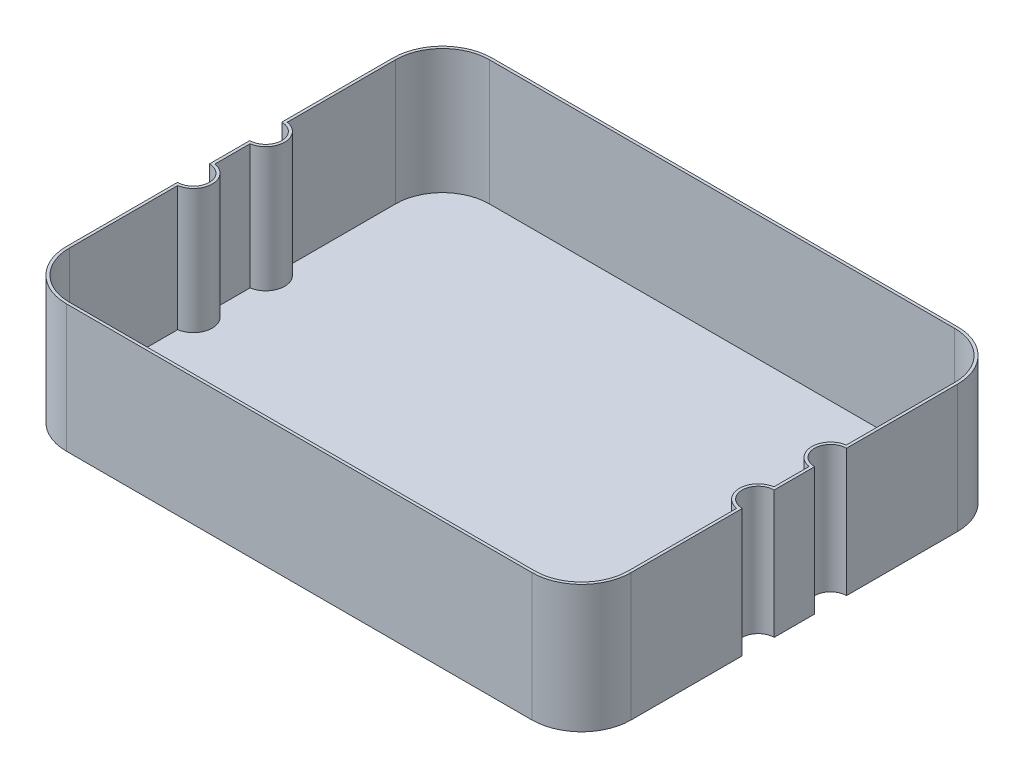
ISO-10303-21;
HEADER;
FILE_DESCRIPTION(('STEP AP214'),'2;1');
FILE_NAME('part.step','',(''),(''),'','','');
FILE_SCHEMA(('AUTOMOTIVE_DESIGN { 1 0 10303 214 1 1 1 1 }'));
ENDSEC;
DATA;
#1=APPLICATION_CONTEXT('core data for automotive mechanical design processes');
#2=APPLICATION_PROTOCOL_DEFINITION('international standard','automotive_design',2000,#1);
#3=PRODUCT_CONTEXT('',#1,'mechanical');
#4=PRODUCT('Part','Part','',(#3));
#5=PRODUCT_RELATED_PRODUCT_CATEGORY('part','',(#4));
#6=PRODUCT_DEFINITION_FORMATION('','',#4);
#7=PRODUCT_DEFINITION_CONTEXT('part definition',#1,'design');
#8=PRODUCT_DEFINITION('design','',#6,#7);
#9=PRODUCT_DEFINITION_SHAPE('','',#8);
#10=(LENGTH_UNIT() NAMED_UNIT(*) SI_UNIT(.MILLI.,.METRE.));
#11=(NAMED_UNIT(*) PLANE_ANGLE_UNIT() SI_UNIT($,.RADIAN.));
#12=(NAMED_UNIT(*) SI_UNIT($,.STERADIAN.) SOLID_ANGLE_UNIT());
#13=UNCERTAINTY_MEASURE_WITH_UNIT(LENGTH_MEASURE(1.E-05),#10,'distance_accuracy_value','');
#14=(GEOMETRIC_REPRESENTATION_CONTEXT(3) GLOBAL_UNCERTAINTY_ASSIGNED_CONTEXT((#13)) GLOBAL_UNIT_ASSIGNED_CONTEXT((#10,
#11,#12)) REPRESENTATION_CONTEXT('',''));
#15=CARTESIAN_POINT('',(0.,0.,0.));
#16=DIRECTION('',(0.,0.,1.));
#17=DIRECTION('',(1.,0.,0.));
#18=AXIS2_PLACEMENT_3D('',#15,#16,#17);
#19=CARTESIAN_POINT('',(199.,90.,150.));
#20=DIRECTION('',(-1.,0.,0.));
#21=DIRECTION('',(0.,0.,1.));
#22=AXIS2_PLACEMENT_3D('',#19,#20,#21);
#23=PLANE('',#22);
#24=DIRECTION('',(0.,0.,-1.));
#25=VECTOR('',#24,1.);
#26=CARTESIAN_POINT('',(199.,0.,150.));
#27=LINE('',#26,#25);
#28=CARTESIAN_POINT('',(199.,0.,14.2499999999999));
#29=VERTEX_POINT('',#28);
#30=CARTESIAN_POINT('',(199.,0.,-14.25));
#31=VERTEX_POINT('',#30);
#32=EDGE_CURVE('E434',#29,#31,#27,.T.);
#33=ORIENTED_EDGE('',*,*,#32,.T.);
#34=DIRECTION('',(0.,1.,0.));
#35=VECTOR('',#34,1.);
#36=CARTESIAN_POINT('',(199.,0.,-14.25));
#37=LINE('',#36,#35);
#38=CARTESIAN_POINT('',(199.,90.,-14.25));
#39=VERTEX_POINT('',#38);
#40=EDGE_CURVE('E58',#31,#39,#37,.T.);
#41=ORIENTED_EDGE('',*,*,#40,.T.);
#42=DIRECTION('',(0.,0.,-1.));
#43=VECTOR('',#42,1.);
#44=CARTESIAN_POINT('',(199.,90.,150.));
#45=LINE('',#44,#43);
#46=CARTESIAN_POINT('',(199.,90.,14.2499999999999));
#47=VERTEX_POINT('',#46);
#48=EDGE_CURVE('E417',#47,#39,#45,.T.);
#49=ORIENTED_EDGE('',*,*,#48,.F.);
#50=DIRECTION('',(0.,1.,0.));
#51=VECTOR('',#50,1.);
#52=CARTESIAN_POINT('',(199.,0.,14.2499999999999));
#53=LINE('',#52,#51);
#54=EDGE_CURVE('E402',#47,#29,#53,.F.);
#55=ORIENTED_EDGE('',*,*,#54,.T.);
#56=EDGE_LOOP('',(#33,#41,#49,#55));
#57=FACE_BOUND('',#56,.T.);
#58=ADVANCED_FACE('F35',(#57),#23,.F.);
#59=CARTESIAN_POINT('',(199.,0.,115.));
#60=VERTEX_POINT('',#59);
#61=CARTESIAN_POINT('',(199.,0.,36.75));
#62=VERTEX_POINT('',#61);
#63=EDGE_CURVE('E430',#60,#62,#27,.T.);
#64=ORIENTED_EDGE('',*,*,#63,.T.);
#65=DIRECTION('',(0.,1.,0.));
#66=VECTOR('',#65,1.);
#67=CARTESIAN_POINT('',(199.,0.,36.75));
#68=LINE('',#67,#66);
#69=CARTESIAN_POINT('',(199.,90.,36.75));
#70=VERTEX_POINT('',#69);
#71=EDGE_CURVE('E405',#62,#70,#68,.T.);
#72=ORIENTED_EDGE('',*,*,#71,.T.);
#73=CARTESIAN_POINT('',(199.,90.,115.));
#74=VERTEX_POINT('',#73);
#75=EDGE_CURVE('E413',#74,#70,#45,.T.);
#76=ORIENTED_EDGE('',*,*,#75,.F.);
#77=DIRECTION('',(0.,-1.,0.));
#78=VECTOR('',#77,1.);
#79=CARTESIAN_POINT('',(199.,90.,115.));
#80=LINE('',#79,#78);
#81=EDGE_CURVE('E478',#74,#60,#80,.T.);
#82=ORIENTED_EDGE('',*,*,#81,.T.);
#83=EDGE_LOOP('',(#64,#72,#76,#82));
#84=FACE_BOUND('',#83,.T.);
#85=ADVANCED_FACE('F531',(#84),#23,.F.);
#86=CARTESIAN_POINT('',(-199.,90.,150.));
#87=DIRECTION('',(1.,0.,0.));
#88=DIRECTION('',(0.,0.,-1.));
#89=AXIS2_PLACEMENT_3D('',#86,#87,#88);
#90=PLANE('',#89);
#91=DIRECTION('',(0.,0.,1.));
#92=VECTOR('',#91,1.);
#93=CARTESIAN_POINT('',(-199.,0.,150.));
#94=LINE('',#93,#92);
#95=CARTESIAN_POINT('',(-199.,0.,-14.25));
#96=VERTEX_POINT('',#95);
#97=CARTESIAN_POINT('',(-199.,0.,14.25));
#98=VERTEX_POINT('',#97);
#99=EDGE_CURVE('E442',#96,#98,#94,.T.);
#100=ORIENTED_EDGE('',*,*,#99,.T.);
#101=DIRECTION('',(0.,1.,0.));
#102=VECTOR('',#101,1.);
#103=CARTESIAN_POINT('',(-199.,0.,14.25));
#104=LINE('',#103,#102);
#105=CARTESIAN_POINT('',(-199.,90.,14.25));
#106=VERTEX_POINT('',#105);
#107=EDGE_CURVE('E399',#98,#106,#104,.T.);
#108=ORIENTED_EDGE('',*,*,#107,.T.);
#109=DIRECTION('',(0.,0.,1.));
#110=VECTOR('',#109,1.);
#111=CARTESIAN_POINT('',(-199.,90.,150.));
#112=LINE('',#111,#110);
#113=CARTESIAN_POINT('',(-199.,90.,-14.25));
#114=VERTEX_POINT('',#113);
#115=EDGE_CURVE('E426',#114,#106,#112,.T.);
#116=ORIENTED_EDGE('',*,*,#115,.F.);
#117=DIRECTION('',(0.,1.,0.));
#118=VECTOR('',#117,1.);
#119=CARTESIAN_POINT('',(-199.,0.,-14.25));
#120=LINE('',#119,#118);
#121=EDGE_CURVE('E389',#114,#96,#120,.F.);
#122=ORIENTED_EDGE('',*,*,#121,.T.);
#123=EDGE_LOOP('',(#100,#108,#116,#122));
#124=FACE_BOUND('',#123,.T.);
#125=ADVANCED_FACE('F498',(#124),#90,.F.);
#126=CARTESIAN_POINT('',(-199.,0.,-115.));
#127=VERTEX_POINT('',#126);
#128=CARTESIAN_POINT('',(-199.,0.,-36.75));
#129=VERTEX_POINT('',#128);
#130=EDGE_CURVE('E438',#127,#129,#94,.T.);
#131=ORIENTED_EDGE('',*,*,#130,.T.);
#132=DIRECTION('',(0.,1.,0.));
#133=VECTOR('',#132,1.);
#134=CARTESIAN_POINT('',(-199.,0.,-36.75));
#135=LINE('',#134,#133);
#136=CARTESIAN_POINT('',(-199.,90.,-36.75));
#137=VERTEX_POINT('',#136);
#138=EDGE_CURVE('E393',#129,#137,#135,.T.);
#139=ORIENTED_EDGE('',*,*,#138,.T.);
#140=CARTESIAN_POINT('',(-199.,90.,-115.));
#141=VERTEX_POINT('',#140);
#142=EDGE_CURVE('E422',#141,#137,#112,.T.);
#143=ORIENTED_EDGE('',*,*,#142,.F.);
#144=DIRECTION('',(0.,-1.,0.));
#145=VECTOR('',#144,1.);
#146=CARTESIAN_POINT('',(-199.,90.,-115.));
#147=LINE('',#146,#145);
#148=EDGE_CURVE('E459',#141,#127,#147,.T.);
#149=ORIENTED_EDGE('',*,*,#148,.T.);
#150=EDGE_LOOP('',(#131,#139,#143,#149));
#151=FACE_BOUND('',#150,.T.);
#152=ADVANCED_FACE('F504',(#151),#90,.F.);
#153=CARTESIAN_POINT('',(199.,90.,-36.7500000000001));
#154=VERTEX_POINT('',#153);
#155=CARTESIAN_POINT('',(199.,90.,-115.));
#156=VERTEX_POINT('',#155);
#157=EDGE_CURVE('E418',#154,#156,#45,.T.);
#158=ORIENTED_EDGE('',*,*,#157,.F.);
#159=DIRECTION('',(0.,1.,0.));
#160=VECTOR('',#159,1.);
#161=CARTESIAN_POINT('',(199.,0.,-36.7500000000001));
#162=LINE('',#161,#160);
#163=CARTESIAN_POINT('',(199.,0.,-36.7500000000001));
#164=VERTEX_POINT('',#163);
#165=EDGE_CURVE('E408',#154,#164,#162,.F.);
#166=ORIENTED_EDGE('',*,*,#165,.T.);
#167=CARTESIAN_POINT('',(199.,0.,-115.));
#168=VERTEX_POINT('',#167);
#169=EDGE_CURVE('E412',#164,#168,#27,.T.);
#170=ORIENTED_EDGE('',*,*,#169,.T.);
#171=DIRECTION('',(0.,-1.,0.));
#172=VECTOR('',#171,1.);
#173=CARTESIAN_POINT('',(199.,90.,-115.));
#174=LINE('',#173,#172);
#175=EDGE_CURVE('E481',#168,#156,#174,.F.);
#176=ORIENTED_EDGE('',*,*,#175,.T.);
#177=EDGE_LOOP('',(#158,#166,#170,#176));
#178=FACE_BOUND('',#177,.T.);
#179=ADVANCED_FACE('F560',(#178),#23,.F.);
#180=CARTESIAN_POINT('',(-199.,90.,-150.));
#181=DIRECTION('',(0.,0.,1.));
#182=DIRECTION('',(1.,0.,0.));
#183=AXIS2_PLACEMENT_3D('',#180,#181,#182);
#184=PLANE('',#183);
#185=DIRECTION('',(-1.,0.,0.));
#186=VECTOR('',#185,1.);
#187=CARTESIAN_POINT('',(-199.,0.,-150.));
#188=LINE('',#187,#186);
#189=CARTESIAN_POINT('',(164.,0.,-150.));
#190=VERTEX_POINT('',#189);
#191=CARTESIAN_POINT('',(-164.,0.,-150.));
#192=VERTEX_POINT('',#191);
#193=EDGE_CURVE('E433',#190,#192,#188,.T.);
#194=ORIENTED_EDGE('',*,*,#193,.T.);
#195=DIRECTION('',(0.,-1.,0.));
#196=VECTOR('',#195,1.);
#197=CARTESIAN_POINT('',(-164.,90.,-150.));
#198=LINE('',#197,#196);
#199=CARTESIAN_POINT('',(-164.,90.,-150.));
#200=VERTEX_POINT('',#199);
#201=EDGE_CURVE('E476',#192,#200,#198,.F.);
#202=ORIENTED_EDGE('',*,*,#201,.T.);
#203=DIRECTION('',(-1.,0.,0.));
#204=VECTOR('',#203,1.);
#205=CARTESIAN_POINT('',(-199.,90.,-150.));
#206=LINE('',#205,#204);
#207=CARTESIAN_POINT('',(164.,90.,-150.));
#208=VERTEX_POINT('',#207);
#209=EDGE_CURVE('E416',#208,#200,#206,.T.);
#210=ORIENTED_EDGE('',*,*,#209,.F.);
#211=DIRECTION('',(0.,-1.,0.));
#212=VECTOR('',#211,1.);
#213=CARTESIAN_POINT('',(164.,90.,-150.));
#214=LINE('',#213,#212);
#215=EDGE_CURVE('E473',#208,#190,#214,.T.);
#216=ORIENTED_EDGE('',*,*,#215,.T.);
#217=EDGE_LOOP('',(#194,#202,#210,#216));
#218=FACE_BOUND('',#217,.T.);
#219=ADVANCED_FACE('F513',(#218),#184,.F.);
#220=CARTESIAN_POINT('',(-199.,90.,36.75));
#221=VERTEX_POINT('',#220);
#222=CARTESIAN_POINT('',(-199.,90.,115.));
#223=VERTEX_POINT('',#222);
#224=EDGE_CURVE('E421',#221,#223,#112,.T.);
#225=ORIENTED_EDGE('',*,*,#224,.F.);
#226=DIRECTION('',(0.,1.,0.));
#227=VECTOR('',#226,1.);
#228=CARTESIAN_POINT('',(-199.,0.,36.75));
#229=LINE('',#228,#227);
#230=CARTESIAN_POINT('',(-199.,0.,36.75));
#231=VERTEX_POINT('',#230);
#232=EDGE_CURVE('E396',#221,#231,#229,.F.);
#233=ORIENTED_EDGE('',*,*,#232,.T.);
#234=CARTESIAN_POINT('',(-199.,0.,115.));
#235=VERTEX_POINT('',#234);
#236=EDGE_CURVE('E437',#231,#235,#94,.T.);
#237=ORIENTED_EDGE('',*,*,#236,.T.);
#238=DIRECTION('',(0.,-1.,0.));
#239=VECTOR('',#238,1.);
#240=CARTESIAN_POINT('',(-199.,90.,115.));
#241=LINE('',#240,#239);
#242=EDGE_CURVE('E462',#235,#223,#241,.F.);
#243=ORIENTED_EDGE('',*,*,#242,.T.);
#244=EDGE_LOOP('',(#225,#233,#237,#243));
#245=FACE_BOUND('',#244,.T.);
#246=ADVANCED_FACE('F493',(#245),#90,.F.);
#247=CARTESIAN_POINT('',(-199.,90.,150.));
#248=DIRECTION('',(0.,0.,-1.));
#249=DIRECTION('',(-1.,0.,0.));
#250=AXIS2_PLACEMENT_3D('',#247,#248,#249);
#251=PLANE('',#250);
#252=DIRECTION('',(1.,0.,0.));
#253=VECTOR('',#252,1.);
#254=CARTESIAN_POINT('',(-199.,90.,150.));
#255=LINE('',#254,#253);
#256=CARTESIAN_POINT('',(-164.,90.,150.));
#257=VERTEX_POINT('',#256);
#258=CARTESIAN_POINT('',(164.,90.,150.));
#259=VERTEX_POINT('',#258);
#260=EDGE_CURVE('E425',#257,#259,#255,.T.);
#261=ORIENTED_EDGE('',*,*,#260,.F.);
#262=DIRECTION('',(0.,-1.,0.));
#263=VECTOR('',#262,1.);
#264=CARTESIAN_POINT('',(-164.,90.,150.));
#265=LINE('',#264,#263);
#266=CARTESIAN_POINT('',(-164.,0.,150.));
#267=VERTEX_POINT('',#266);
#268=EDGE_CURVE('E446',#257,#267,#265,.T.);
#269=ORIENTED_EDGE('',*,*,#268,.T.);
#270=DIRECTION('',(1.,0.,0.));
#271=VECTOR('',#270,1.);
#272=CARTESIAN_POINT('',(-199.,0.,150.));
#273=LINE('',#272,#271);
#274=CARTESIAN_POINT('',(164.,0.,150.));
#275=VERTEX_POINT('',#274);
#276=EDGE_CURVE('E441',#267,#275,#273,.T.);
#277=ORIENTED_EDGE('',*,*,#276,.T.);
#278=DIRECTION('',(0.,-1.,0.));
#279=VECTOR('',#278,1.);
#280=CARTESIAN_POINT('',(164.,90.,150.));
#281=LINE('',#280,#279);
#282=EDGE_CURVE('E429',#275,#259,#281,.F.);
#283=ORIENTED_EDGE('',*,*,#282,.T.);
#284=EDGE_LOOP('',(#261,#269,#277,#283));
#285=FACE_BOUND('',#284,.T.);
#286=ADVANCED_FACE('F539',(#285),#251,.F.);
#287=CARTESIAN_POINT('',(0.,90.,0.));
#288=DIRECTION('',(0.,-1.,0.));
#289=DIRECTION('',(0.,0.,-1.));
#290=AXIS2_PLACEMENT_3D('',#287,#288,#289);
#291=PLANE('',#290);
#292=DIRECTION('',(0.,0.,-1.));
#293=VECTOR('',#292,1.);
#294=CARTESIAN_POINT('',(197.,90.,0.));
#295=LINE('',#294,#293);
#296=CARTESIAN_POINT('',(197.,90.,12.4018131025702));
#297=VERTEX_POINT('',#296);
#298=CARTESIAN_POINT('',(197.,90.,-12.4018131025703));
#299=VERTEX_POINT('',#298);
#300=EDGE_CURVE('E250',#297,#299,#295,.T.);
#301=ORIENTED_EDGE('',*,*,#300,.F.);
#302=CARTESIAN_POINT('',(199.,90.,25.5));
#303=DIRECTION('',(0.,-1.,0.));
#304=DIRECTION('',(0.,0.,-1.));
#305=AXIS2_PLACEMENT_3D('',#302,#303,#304);
#306=CIRCLE('',#305,13.25);
#307=CARTESIAN_POINT('',(197.,90.,38.5981868974297));
#308=VERTEX_POINT('',#307);
#309=EDGE_CURVE('E262',#297,#308,#306,.F.);
#310=ORIENTED_EDGE('',*,*,#309,.T.);
#311=DIRECTION('',(0.,0.,-1.));
#312=VECTOR('',#311,1.);
#313=CARTESIAN_POINT('',(197.,90.,0.));
#314=LINE('',#313,#312);
#315=CARTESIAN_POINT('',(197.,90.,115.));
#316=VERTEX_POINT('',#315);
#317=EDGE_CURVE('E50',#316,#308,#314,.T.);
#318=ORIENTED_EDGE('',*,*,#317,.F.);
#319=CARTESIAN_POINT('',(164.,90.,115.));
#320=DIRECTION('',(0.,-1.,0.));
#321=DIRECTION('',(0.,0.,-1.));
#322=AXIS2_PLACEMENT_3D('',#319,#320,#321);
#323=CIRCLE('',#322,33.);
#324=CARTESIAN_POINT('',(164.,90.,148.));
#325=VERTEX_POINT('',#324);
#326=EDGE_CURVE('E329',#325,#316,#323,.F.);
#327=ORIENTED_EDGE('',*,*,#326,.F.);
#328=DIRECTION('',(1.,0.,0.));
#329=VECTOR('',#328,1.);
#330=CARTESIAN_POINT('',(0.,90.,148.));
#331=LINE('',#330,#329);
#332=CARTESIAN_POINT('',(-164.,90.,148.));
#333=VERTEX_POINT('',#332);
#334=EDGE_CURVE('E323',#333,#325,#331,.T.);
#335=ORIENTED_EDGE('',*,*,#334,.F.);
#336=CARTESIAN_POINT('',(-164.,90.,115.));
#337=DIRECTION('',(0.,-1.,0.));
#338=DIRECTION('',(0.,0.,-1.));
#339=AXIS2_PLACEMENT_3D('',#336,#337,#338);
#340=CIRCLE('',#339,33.);
#341=CARTESIAN_POINT('',(-197.,90.,115.));
#342=VERTEX_POINT('',#341);
#343=EDGE_CURVE('E344',#342,#333,#340,.F.);
#344=ORIENTED_EDGE('',*,*,#343,.F.);
#345=DIRECTION('',(0.,0.,1.));
#346=VECTOR('',#345,1.);
#347=CARTESIAN_POINT('',(-197.,90.,0.));
#348=LINE('',#347,#346);
#349=CARTESIAN_POINT('',(-197.,90.,38.5981868974297));
#350=VERTEX_POINT('',#349);
#351=EDGE_CURVE('E357',#350,#342,#348,.T.);
#352=ORIENTED_EDGE('',*,*,#351,.F.);
#353=CARTESIAN_POINT('',(-199.,90.,25.5));
#354=DIRECTION('',(0.,-1.,0.));
#355=DIRECTION('',(0.,0.,-1.));
#356=AXIS2_PLACEMENT_3D('',#353,#354,#355);
#357=CIRCLE('',#356,13.25);
#358=CARTESIAN_POINT('',(-197.,90.,12.4018131025703));
#359=VERTEX_POINT('',#358);
#360=EDGE_CURVE('E365',#350,#359,#357,.F.);
#361=ORIENTED_EDGE('',*,*,#360,.T.);
#362=DIRECTION('',(0.,0.,1.));
#363=VECTOR('',#362,1.);
#364=CARTESIAN_POINT('',(-197.,90.,0.));
#365=LINE('',#364,#363);
#366=CARTESIAN_POINT('',(-197.,90.,-12.4018131025703));
#367=VERTEX_POINT('',#366);
#368=EDGE_CURVE('E362',#367,#359,#365,.T.);
#369=ORIENTED_EDGE('',*,*,#368,.F.);
#370=CARTESIAN_POINT('',(-199.,90.,-25.5));
#371=DIRECTION('',(0.,-1.,0.));
#372=DIRECTION('',(0.,0.,-1.));
#373=AXIS2_PLACEMENT_3D('',#370,#371,#372);
#374=CIRCLE('',#373,13.25);
#375=CARTESIAN_POINT('',(-197.,90.,-38.5981868974297));
#376=VERTEX_POINT('',#375);
#377=EDGE_CURVE('E308',#367,#376,#374,.F.);
#378=ORIENTED_EDGE('',*,*,#377,.T.);
#379=DIRECTION('',(0.,0.,1.));
#380=VECTOR('',#379,1.);
#381=CARTESIAN_POINT('',(-197.,90.,0.));
#382=LINE('',#381,#380);
#383=CARTESIAN_POINT('',(-197.,90.,-115.));
#384=VERTEX_POINT('',#383);
#385=EDGE_CURVE('E359',#384,#376,#382,.T.);
#386=ORIENTED_EDGE('',*,*,#385,.F.);
#387=CARTESIAN_POINT('',(-164.,90.,-115.));
#388=DIRECTION('',(0.,-1.,0.));
#389=DIRECTION('',(0.,0.,-1.));
#390=AXIS2_PLACEMENT_3D('',#387,#388,#389);
#391=CIRCLE('',#390,33.);
#392=CARTESIAN_POINT('',(-164.,90.,-148.));
#393=VERTEX_POINT('',#392);
#394=EDGE_CURVE('E353',#393,#384,#391,.F.);
#395=ORIENTED_EDGE('',*,*,#394,.F.);
#396=DIRECTION('',(-1.,0.,0.));
#397=VECTOR('',#396,1.);
#398=CARTESIAN_POINT('',(0.,90.,-148.));
#399=LINE('',#398,#397);
#400=CARTESIAN_POINT('',(164.,90.,-148.));
#401=VERTEX_POINT('',#400);
#402=EDGE_CURVE('E354',#401,#393,#399,.T.);
#403=ORIENTED_EDGE('',*,*,#402,.F.);
#404=CARTESIAN_POINT('',(164.,90.,-115.));
#405=DIRECTION('',(0.,-1.,0.));
#406=DIRECTION('',(0.,0.,-1.));
#407=AXIS2_PLACEMENT_3D('',#404,#405,#406);
#408=CIRCLE('',#407,33.);
#409=CARTESIAN_POINT('',(197.,90.,-115.));
#410=VERTEX_POINT('',#409);
#411=EDGE_CURVE('E351',#410,#401,#408,.F.);
#412=ORIENTED_EDGE('',*,*,#411,.F.);
#413=DIRECTION('',(0.,0.,-1.));
#414=VECTOR('',#413,1.);
#415=CARTESIAN_POINT('',(197.,90.,0.));
#416=LINE('',#415,#414);
#417=CARTESIAN_POINT('',(197.,90.,-38.5981868974298));
#418=VERTEX_POINT('',#417);
#419=EDGE_CURVE('E290',#418,#410,#416,.T.);
#420=ORIENTED_EDGE('',*,*,#419,.F.);
#421=CARTESIAN_POINT('',(199.,90.,-25.5));
#422=DIRECTION('',(0.,-1.,0.));
#423=DIRECTION('',(0.,0.,-1.));
#424=AXIS2_PLACEMENT_3D('',#421,#422,#423);
#425=CIRCLE('',#424,13.25);
#426=EDGE_CURVE('E263',#418,#299,#425,.F.);
#427=ORIENTED_EDGE('',*,*,#426,.T.);
#428=EDGE_LOOP('',(#301,#310,#318,#327,#335,#344,#352,#361,#369,#378,#386,#395,#403,#412,#420,#427));
#429=FACE_BOUND('',#428,.T.);
#430=ORIENTED_EDGE('',*,*,#48,.T.);
#431=CARTESIAN_POINT('',(199.,90.,-25.5));
#432=DIRECTION('',(0.,1.,0.));
#433=DIRECTION('',(0.,0.,-1.));
#434=AXIS2_PLACEMENT_3D('',#431,#432,#433);
#435=CIRCLE('',#434,11.25);
#436=EDGE_CURVE('E280',#154,#39,#435,.T.);
#437=ORIENTED_EDGE('',*,*,#436,.F.);
#438=ORIENTED_EDGE('',*,*,#157,.T.);
#439=CARTESIAN_POINT('',(164.,90.,-115.));
#440=DIRECTION('',(0.,-1.,0.));
#441=DIRECTION('',(0.,0.,-1.));
#442=AXIS2_PLACEMENT_3D('',#439,#440,#441);
#443=CIRCLE('',#442,35.);
#444=EDGE_CURVE('E467',#156,#208,#443,.F.);
#445=ORIENTED_EDGE('',*,*,#444,.T.);
#446=ORIENTED_EDGE('',*,*,#209,.T.);
#447=CARTESIAN_POINT('',(-164.,90.,-115.));
#448=DIRECTION('',(0.,-1.,0.));
#449=DIRECTION('',(0.,0.,-1.));
#450=AXIS2_PLACEMENT_3D('',#447,#448,#449);
#451=CIRCLE('',#450,35.);
#452=EDGE_CURVE('E469',#200,#141,#451,.F.);
#453=ORIENTED_EDGE('',*,*,#452,.T.);
#454=ORIENTED_EDGE('',*,*,#142,.T.);
#455=CARTESIAN_POINT('',(-199.,90.,-25.5));
#456=DIRECTION('',(0.,1.,0.));
#457=DIRECTION('',(0.,0.,1.));
#458=AXIS2_PLACEMENT_3D('',#455,#456,#457);
#459=CIRCLE('',#458,11.25);
#460=EDGE_CURVE('E380',#114,#137,#459,.T.);
#461=ORIENTED_EDGE('',*,*,#460,.F.);
#462=ORIENTED_EDGE('',*,*,#115,.T.);
#463=CARTESIAN_POINT('',(-199.,90.,25.5));
#464=DIRECTION('',(0.,1.,0.));
#465=DIRECTION('',(0.,0.,-1.));
#466=AXIS2_PLACEMENT_3D('',#463,#464,#465);
#467=CIRCLE('',#466,11.25);
#468=EDGE_CURVE('E378',#221,#106,#467,.T.);
#469=ORIENTED_EDGE('',*,*,#468,.F.);
#470=ORIENTED_EDGE('',*,*,#224,.T.);
#471=CARTESIAN_POINT('',(-164.,90.,115.));
#472=DIRECTION('',(0.,-1.,0.));
#473=DIRECTION('',(0.,0.,-1.));
#474=AXIS2_PLACEMENT_3D('',#471,#472,#473);
#475=CIRCLE('',#474,35.);
#476=EDGE_CURVE('E471',#223,#257,#475,.F.);
#477=ORIENTED_EDGE('',*,*,#476,.T.);
#478=ORIENTED_EDGE('',*,*,#260,.T.);
#479=CARTESIAN_POINT('',(164.,90.,115.));
#480=DIRECTION('',(0.,-1.,0.));
#481=DIRECTION('',(0.,0.,-1.));
#482=AXIS2_PLACEMENT_3D('',#479,#480,#481);
#483=CIRCLE('',#482,35.);
#484=EDGE_CURVE('E465',#259,#74,#483,.F.);
#485=ORIENTED_EDGE('',*,*,#484,.T.);
#486=ORIENTED_EDGE('',*,*,#75,.T.);
#487=CARTESIAN_POINT('',(199.,90.,25.5));
#488=DIRECTION('',(0.,1.,0.));
#489=DIRECTION('',(0.,0.,1.));
#490=AXIS2_PLACEMENT_3D('',#487,#488,#489);
#491=CIRCLE('',#490,11.25);
#492=EDGE_CURVE('E381',#47,#70,#491,.T.);
#493=ORIENTED_EDGE('',*,*,#492,.F.);
#494=EDGE_LOOP('',(#430,#437,#438,#445,#446,#453,#454,#461,#462,#469,#470,#477,#478,#485,#486,#493));
#495=FACE_BOUND('',#494,.T.);
#496=ADVANCED_FACE('F545',(#429,#495),#291,.F.);
#497=CARTESIAN_POINT('',(0.,0.,0.));
#498=DIRECTION('',(0.,-1.,0.));
#499=DIRECTION('',(0.,0.,-1.));
#500=AXIS2_PLACEMENT_3D('',#497,#498,#499);
#501=PLANE('',#500);
#502=CARTESIAN_POINT('',(199.,0.,-25.5));
#503=DIRECTION('',(0.,1.,0.));
#504=DIRECTION('',(0.,0.,-1.));
#505=AXIS2_PLACEMENT_3D('',#502,#503,#504);
#506=CIRCLE('',#505,11.25);
#507=EDGE_CURVE('E383',#164,#31,#506,.T.);
#508=ORIENTED_EDGE('',*,*,#507,.T.);
#509=ORIENTED_EDGE('',*,*,#32,.F.);
#510=CARTESIAN_POINT('',(199.,0.,25.5));
#511=DIRECTION('',(0.,-1.,0.));
#512=DIRECTION('',(0.,0.,-1.));
#513=AXIS2_PLACEMENT_3D('',#510,#511,#512);
#514=CIRCLE('',#513,11.25);
#515=EDGE_CURVE('E11',#62,#29,#514,.T.);
#516=ORIENTED_EDGE('',*,*,#515,.F.);
#517=ORIENTED_EDGE('',*,*,#63,.F.);
#518=CARTESIAN_POINT('',(164.,0.,115.));
#519=DIRECTION('',(0.,-1.,0.));
#520=DIRECTION('',(0.,0.,-1.));
#521=AXIS2_PLACEMENT_3D('',#518,#519,#520);
#522=CIRCLE('',#521,35.);
#523=EDGE_CURVE('E449',#60,#275,#522,.T.);
#524=ORIENTED_EDGE('',*,*,#523,.T.);
#525=ORIENTED_EDGE('',*,*,#276,.F.);
#526=CARTESIAN_POINT('',(-164.,0.,115.));
#527=DIRECTION('',(0.,-1.,0.));
#528=DIRECTION('',(0.,0.,-1.));
#529=AXIS2_PLACEMENT_3D('',#526,#527,#528);
#530=CIRCLE('',#529,35.);
#531=EDGE_CURVE('E456',#267,#235,#530,.T.);
#532=ORIENTED_EDGE('',*,*,#531,.T.);
#533=ORIENTED_EDGE('',*,*,#236,.F.);
#534=CARTESIAN_POINT('',(-199.,0.,25.5));
#535=DIRECTION('',(0.,-1.,0.));
#536=DIRECTION('',(0.,0.,-1.));
#537=AXIS2_PLACEMENT_3D('',#534,#535,#536);
#538=CIRCLE('',#537,11.25);
#539=EDGE_CURVE('E43',#98,#231,#538,.T.);
#540=ORIENTED_EDGE('',*,*,#539,.F.);
#541=ORIENTED_EDGE('',*,*,#99,.F.);
#542=CARTESIAN_POINT('',(-199.,0.,-25.5));
#543=DIRECTION('',(0.,1.,0.));
#544=DIRECTION('',(0.,0.,1.));
#545=AXIS2_PLACEMENT_3D('',#542,#543,#544);
#546=CIRCLE('',#545,11.25);
#547=EDGE_CURVE('E386',#96,#129,#546,.T.);
#548=ORIENTED_EDGE('',*,*,#547,.T.);
#549=ORIENTED_EDGE('',*,*,#130,.F.);
#550=CARTESIAN_POINT('',(-164.,0.,-115.));
#551=DIRECTION('',(0.,-1.,0.));
#552=DIRECTION('',(0.,0.,-1.));
#553=AXIS2_PLACEMENT_3D('',#550,#551,#552);
#554=CIRCLE('',#553,35.);
#555=EDGE_CURVE('E454',#127,#192,#554,.T.);
#556=ORIENTED_EDGE('',*,*,#555,.T.);
#557=ORIENTED_EDGE('',*,*,#193,.F.);
#558=CARTESIAN_POINT('',(164.,0.,-115.));
#559=DIRECTION('',(0.,-1.,0.));
#560=DIRECTION('',(0.,0.,-1.));
#561=AXIS2_PLACEMENT_3D('',#558,#559,#560);
#562=CIRCLE('',#561,35.);
#563=EDGE_CURVE('E451',#190,#168,#562,.T.);
#564=ORIENTED_EDGE('',*,*,#563,.T.);
#565=ORIENTED_EDGE('',*,*,#169,.F.);
#566=EDGE_LOOP('',(#508,#509,#516,#517,#524,#525,#532,#533,#540,#541,#548,#549,#556,#557,#564,#565));
#567=FACE_BOUND('',#566,.T.);
#568=ADVANCED_FACE('F494',(#567),#501,.T.);
#569=CARTESIAN_POINT('',(-164.,90.,115.));
#570=DIRECTION('',(0.,-1.,0.));
#571=DIRECTION('',(0.,0.,-1.));
#572=AXIS2_PLACEMENT_3D('',#569,#570,#571);
#573=CYLINDRICAL_SURFACE('',#572,35.);
#574=ORIENTED_EDGE('',*,*,#476,.F.);
#575=ORIENTED_EDGE('',*,*,#242,.F.);
#576=ORIENTED_EDGE('',*,*,#531,.F.);
#577=ORIENTED_EDGE('',*,*,#268,.F.);
#578=EDGE_LOOP('',(#574,#575,#576,#577));
#579=FACE_BOUND('',#578,.T.);
#580=ADVANCED_FACE('F543',(#579),#573,.T.);
#581=CARTESIAN_POINT('',(-164.,90.,-115.));
#582=DIRECTION('',(0.,-1.,0.));
#583=DIRECTION('',(0.,0.,-1.));
#584=AXIS2_PLACEMENT_3D('',#581,#582,#583);
#585=CYLINDRICAL_SURFACE('',#584,35.);
#586=ORIENTED_EDGE('',*,*,#452,.F.);
#587=ORIENTED_EDGE('',*,*,#201,.F.);
#588=ORIENTED_EDGE('',*,*,#555,.F.);
#589=ORIENTED_EDGE('',*,*,#148,.F.);
#590=EDGE_LOOP('',(#586,#587,#588,#589));
#591=FACE_BOUND('',#590,.T.);
#592=ADVANCED_FACE('F509',(#591),#585,.T.);
#593=CARTESIAN_POINT('',(164.,90.,-115.));
#594=DIRECTION('',(0.,-1.,0.));
#595=DIRECTION('',(0.,0.,-1.));
#596=AXIS2_PLACEMENT_3D('',#593,#594,#595);
#597=CYLINDRICAL_SURFACE('',#596,35.);
#598=ORIENTED_EDGE('',*,*,#444,.F.);
#599=ORIENTED_EDGE('',*,*,#175,.F.);
#600=ORIENTED_EDGE('',*,*,#563,.F.);
#601=ORIENTED_EDGE('',*,*,#215,.F.);
#602=EDGE_LOOP('',(#598,#599,#600,#601));
#603=FACE_BOUND('',#602,.T.);
#604=ADVANCED_FACE('F518',(#603),#597,.T.);
#605=CARTESIAN_POINT('',(164.,90.,115.));
#606=DIRECTION('',(0.,-1.,0.));
#607=DIRECTION('',(0.,0.,-1.));
#608=AXIS2_PLACEMENT_3D('',#605,#606,#607);
#609=CYLINDRICAL_SURFACE('',#608,35.);
#610=ORIENTED_EDGE('',*,*,#484,.F.);
#611=ORIENTED_EDGE('',*,*,#282,.F.);
#612=ORIENTED_EDGE('',*,*,#523,.F.);
#613=ORIENTED_EDGE('',*,*,#81,.F.);
#614=EDGE_LOOP('',(#610,#611,#612,#613));
#615=FACE_BOUND('',#614,.T.);
#616=ADVANCED_FACE('F37',(#615),#609,.T.);
#617=CARTESIAN_POINT('',(-199.,0.,-25.5));
#618=DIRECTION('',(0.,1.,0.));
#619=DIRECTION('',(0.,0.,1.));
#620=AXIS2_PLACEMENT_3D('',#617,#618,#619);
#621=CYLINDRICAL_SURFACE('',#620,11.25);
#622=ORIENTED_EDGE('',*,*,#547,.F.);
#623=ORIENTED_EDGE('',*,*,#121,.F.);
#624=ORIENTED_EDGE('',*,*,#460,.T.);
#625=ORIENTED_EDGE('',*,*,#138,.F.);
#626=EDGE_LOOP('',(#622,#623,#624,#625));
#627=FACE_BOUND('',#626,.T.);
#628=ADVANCED_FACE('F547',(#627),#621,.F.);
#629=CARTESIAN_POINT('',(-199.,0.,25.5));
#630=DIRECTION('',(0.,1.,0.));
#631=DIRECTION('',(0.,0.,1.));
#632=AXIS2_PLACEMENT_3D('',#629,#630,#631);
#633=CYLINDRICAL_SURFACE('',#632,11.25);
#634=ORIENTED_EDGE('',*,*,#539,.T.);
#635=ORIENTED_EDGE('',*,*,#232,.F.);
#636=ORIENTED_EDGE('',*,*,#468,.T.);
#637=ORIENTED_EDGE('',*,*,#107,.F.);
#638=EDGE_LOOP('',(#634,#635,#636,#637));
#639=FACE_BOUND('',#638,.T.);
#640=ADVANCED_FACE('F485',(#639),#633,.F.);
#641=CARTESIAN_POINT('',(199.,0.,25.5));
#642=DIRECTION('',(0.,1.,0.));
#643=DIRECTION('',(0.,0.,1.));
#644=AXIS2_PLACEMENT_3D('',#641,#642,#643);
#645=CYLINDRICAL_SURFACE('',#644,11.25);
#646=ORIENTED_EDGE('',*,*,#515,.T.);
#647=ORIENTED_EDGE('',*,*,#54,.F.);
#648=ORIENTED_EDGE('',*,*,#492,.T.);
#649=ORIENTED_EDGE('',*,*,#71,.F.);
#650=EDGE_LOOP('',(#646,#647,#648,#649));
#651=FACE_BOUND('',#650,.T.);
#652=ADVANCED_FACE('F554',(#651),#645,.F.);
#653=CARTESIAN_POINT('',(199.,0.,-25.5));
#654=DIRECTION('',(0.,1.,0.));
#655=DIRECTION('',(0.,0.,1.));
#656=AXIS2_PLACEMENT_3D('',#653,#654,#655);
#657=CYLINDRICAL_SURFACE('',#656,11.25);
#658=ORIENTED_EDGE('',*,*,#507,.F.);
#659=ORIENTED_EDGE('',*,*,#165,.F.);
#660=ORIENTED_EDGE('',*,*,#436,.T.);
#661=ORIENTED_EDGE('',*,*,#40,.F.);
#662=EDGE_LOOP('',(#658,#659,#660,#661));
#663=FACE_BOUND('',#662,.T.);
#664=ADVANCED_FACE('F576',(#663),#657,.F.);
#665=CARTESIAN_POINT('',(197.,90.,150.));
#666=DIRECTION('',(-1.,0.,0.));
#667=DIRECTION('',(0.,0.,1.));
#668=AXIS2_PLACEMENT_3D('',#665,#666,#667);
#669=PLANE('',#668);
#670=DIRECTION('',(0.,0.,-1.));
#671=VECTOR('',#670,1.);
#672=CARTESIAN_POINT('',(197.,2.,0.));
#673=LINE('',#672,#671);
#674=CARTESIAN_POINT('',(197.,2.,12.4018131025702));
#675=VERTEX_POINT('',#674);
#676=CARTESIAN_POINT('',(197.,2.,-12.4018131025703));
#677=VERTEX_POINT('',#676);
#678=EDGE_CURVE('E248',#675,#677,#673,.T.);
#679=ORIENTED_EDGE('',*,*,#678,.F.);
#680=DIRECTION('',(0.,1.,0.));
#681=VECTOR('',#680,1.);
#682=CARTESIAN_POINT('',(197.,90.,12.4018131025702));
#683=LINE('',#682,#681);
#684=EDGE_CURVE('E276',#297,#675,#683,.F.);
#685=ORIENTED_EDGE('',*,*,#684,.F.);
#686=ORIENTED_EDGE('',*,*,#300,.T.);
#687=DIRECTION('',(0.,1.,0.));
#688=VECTOR('',#687,1.);
#689=CARTESIAN_POINT('',(197.,2.,-12.4018131025703));
#690=LINE('',#689,#688);
#691=EDGE_CURVE('E244',#677,#299,#690,.T.);
#692=ORIENTED_EDGE('',*,*,#691,.F.);
#693=EDGE_LOOP('',(#679,#685,#686,#692));
#694=FACE_BOUND('',#693,.T.);
#695=ADVANCED_FACE('F246',(#694),#669,.T.);
#696=DIRECTION('',(0.,0.,-1.));
#697=VECTOR('',#696,1.);
#698=CARTESIAN_POINT('',(197.,2.,0.));
#699=LINE('',#698,#697);
#700=CARTESIAN_POINT('',(197.,2.,115.));
#701=VERTEX_POINT('',#700);
#702=CARTESIAN_POINT('',(197.,2.,38.5981868974297));
#703=VERTEX_POINT('',#702);
#704=EDGE_CURVE('E270',#701,#703,#699,.T.);
#705=ORIENTED_EDGE('',*,*,#704,.F.);
#706=DIRECTION('',(0.,1.,0.));
#707=VECTOR('',#706,1.);
#708=CARTESIAN_POINT('',(197.,90.,115.));
#709=LINE('',#708,#707);
#710=EDGE_CURVE('E317',#316,#701,#709,.F.);
#711=ORIENTED_EDGE('',*,*,#710,.F.);
#712=ORIENTED_EDGE('',*,*,#317,.T.);
#713=DIRECTION('',(0.,1.,0.));
#714=VECTOR('',#713,1.);
#715=CARTESIAN_POINT('',(197.,2.,38.5981868974297));
#716=LINE('',#715,#714);
#717=EDGE_CURVE('E277',#703,#308,#716,.T.);
#718=ORIENTED_EDGE('',*,*,#717,.F.);
#719=EDGE_LOOP('',(#705,#711,#712,#718));
#720=FACE_BOUND('',#719,.T.);
#721=ADVANCED_FACE('F628',(#720),#669,.T.);
#722=CARTESIAN_POINT('',(-197.,90.,150.));
#723=DIRECTION('',(1.,0.,0.));
#724=DIRECTION('',(0.,0.,-1.));
#725=AXIS2_PLACEMENT_3D('',#722,#723,#724);
#726=PLANE('',#725);
#727=DIRECTION('',(0.,0.,1.));
#728=VECTOR('',#727,1.);
#729=CARTESIAN_POINT('',(-197.,2.,0.));
#730=LINE('',#729,#728);
#731=CARTESIAN_POINT('',(-197.,2.,-12.4018131025703));
#732=VERTEX_POINT('',#731);
#733=CARTESIAN_POINT('',(-197.,2.,12.4018131025703));
#734=VERTEX_POINT('',#733);
#735=EDGE_CURVE('E299',#732,#734,#730,.T.);
#736=ORIENTED_EDGE('',*,*,#735,.F.);
#737=DIRECTION('',(0.,1.,0.));
#738=VECTOR('',#737,1.);
#739=CARTESIAN_POINT('',(-197.,90.,-12.4018131025703));
#740=LINE('',#739,#738);
#741=EDGE_CURVE('E307',#367,#732,#740,.F.);
#742=ORIENTED_EDGE('',*,*,#741,.F.);
#743=ORIENTED_EDGE('',*,*,#368,.T.);
#744=DIRECTION('',(0.,1.,0.));
#745=VECTOR('',#744,1.);
#746=CARTESIAN_POINT('',(-197.,2.,12.4018131025703));
#747=LINE('',#746,#745);
#748=EDGE_CURVE('E278',#734,#359,#747,.T.);
#749=ORIENTED_EDGE('',*,*,#748,.F.);
#750=EDGE_LOOP('',(#736,#742,#743,#749));
#751=FACE_BOUND('',#750,.T.);
#752=ADVANCED_FACE('F624',(#751),#726,.T.);
#753=DIRECTION('',(0.,0.,1.));
#754=VECTOR('',#753,1.);
#755=CARTESIAN_POINT('',(-197.,2.,0.));
#756=LINE('',#755,#754);
#757=CARTESIAN_POINT('',(-197.,2.,-115.));
#758=VERTEX_POINT('',#757);
#759=CARTESIAN_POINT('',(-197.,2.,-38.5981868974297));
#760=VERTEX_POINT('',#759);
#761=EDGE_CURVE('E291',#758,#760,#756,.T.);
#762=ORIENTED_EDGE('',*,*,#761,.F.);
#763=DIRECTION('',(0.,1.,0.));
#764=VECTOR('',#763,1.);
#765=CARTESIAN_POINT('',(-197.,90.,-115.));
#766=LINE('',#765,#764);
#767=EDGE_CURVE('E295',#384,#758,#766,.F.);
#768=ORIENTED_EDGE('',*,*,#767,.F.);
#769=ORIENTED_EDGE('',*,*,#385,.T.);
#770=DIRECTION('',(0.,1.,0.));
#771=VECTOR('',#770,1.);
#772=CARTESIAN_POINT('',(-197.,2.,-38.5981868974297));
#773=LINE('',#772,#771);
#774=EDGE_CURVE('E333',#760,#376,#773,.T.);
#775=ORIENTED_EDGE('',*,*,#774,.F.);
#776=EDGE_LOOP('',(#762,#768,#769,#775));
#777=FACE_BOUND('',#776,.T.);
#778=ADVANCED_FACE('F627',(#777),#726,.T.);
#779=ORIENTED_EDGE('',*,*,#419,.T.);
#780=DIRECTION('',(0.,1.,0.));
#781=VECTOR('',#780,1.);
#782=CARTESIAN_POINT('',(197.,90.,-115.));
#783=LINE('',#782,#781);
#784=CARTESIAN_POINT('',(197.,2.,-115.));
#785=VERTEX_POINT('',#784);
#786=EDGE_CURVE('E301',#785,#410,#783,.T.);
#787=ORIENTED_EDGE('',*,*,#786,.F.);
#788=DIRECTION('',(0.,0.,-1.));
#789=VECTOR('',#788,1.);
#790=CARTESIAN_POINT('',(197.,2.,0.));
#791=LINE('',#790,#789);
#792=CARTESIAN_POINT('',(197.,2.,-38.5981868974298));
#793=VERTEX_POINT('',#792);
#794=EDGE_CURVE('E254',#793,#785,#791,.T.);
#795=ORIENTED_EDGE('',*,*,#794,.F.);
#796=DIRECTION('',(0.,1.,0.));
#797=VECTOR('',#796,1.);
#798=CARTESIAN_POINT('',(197.,90.,-38.5981868974298));
#799=LINE('',#798,#797);
#800=EDGE_CURVE('E255',#418,#793,#799,.F.);
#801=ORIENTED_EDGE('',*,*,#800,.F.);
#802=EDGE_LOOP('',(#779,#787,#795,#801));
#803=FACE_BOUND('',#802,.T.);
#804=ADVANCED_FACE('F622',(#803),#669,.T.);
#805=CARTESIAN_POINT('',(-199.,90.,-148.));
#806=DIRECTION('',(0.,0.,1.));
#807=DIRECTION('',(1.,0.,0.));
#808=AXIS2_PLACEMENT_3D('',#805,#806,#807);
#809=PLANE('',#808);
#810=DIRECTION('',(-1.,0.,0.));
#811=VECTOR('',#810,1.);
#812=CARTESIAN_POINT('',(0.,2.,-148.));
#813=LINE('',#812,#811);
#814=CARTESIAN_POINT('',(164.,2.,-148.));
#815=VERTEX_POINT('',#814);
#816=CARTESIAN_POINT('',(-164.,2.,-148.));
#817=VERTEX_POINT('',#816);
#818=EDGE_CURVE('E272',#815,#817,#813,.T.);
#819=ORIENTED_EDGE('',*,*,#818,.F.);
#820=DIRECTION('',(0.,1.,0.));
#821=VECTOR('',#820,1.);
#822=CARTESIAN_POINT('',(164.,90.,-148.));
#823=LINE('',#822,#821);
#824=EDGE_CURVE('E341',#401,#815,#823,.F.);
#825=ORIENTED_EDGE('',*,*,#824,.F.);
#826=ORIENTED_EDGE('',*,*,#402,.T.);
#827=DIRECTION('',(0.,1.,0.));
#828=VECTOR('',#827,1.);
#829=CARTESIAN_POINT('',(-164.,90.,-148.));
#830=LINE('',#829,#828);
#831=EDGE_CURVE('E320',#817,#393,#830,.T.);
#832=ORIENTED_EDGE('',*,*,#831,.F.);
#833=EDGE_LOOP('',(#819,#825,#826,#832));
#834=FACE_BOUND('',#833,.T.);
#835=ADVANCED_FACE('F619',(#834),#809,.T.);
#836=ORIENTED_EDGE('',*,*,#351,.T.);
#837=DIRECTION('',(0.,1.,0.));
#838=VECTOR('',#837,1.);
#839=CARTESIAN_POINT('',(-197.,90.,115.));
#840=LINE('',#839,#838);
#841=CARTESIAN_POINT('',(-197.,2.,115.));
#842=VERTEX_POINT('',#841);
#843=EDGE_CURVE('E326',#842,#342,#840,.T.);
#844=ORIENTED_EDGE('',*,*,#843,.F.);
#845=DIRECTION('',(0.,0.,1.));
#846=VECTOR('',#845,1.);
#847=CARTESIAN_POINT('',(-197.,2.,0.));
#848=LINE('',#847,#846);
#849=CARTESIAN_POINT('',(-197.,2.,38.5981868974297));
#850=VERTEX_POINT('',#849);
#851=EDGE_CURVE('E297',#850,#842,#848,.T.);
#852=ORIENTED_EDGE('',*,*,#851,.F.);
#853=DIRECTION('',(0.,1.,0.));
#854=VECTOR('',#853,1.);
#855=CARTESIAN_POINT('',(-197.,90.,38.5981868974297));
#856=LINE('',#855,#854);
#857=EDGE_CURVE('E330',#350,#850,#856,.F.);
#858=ORIENTED_EDGE('',*,*,#857,.F.);
#859=EDGE_LOOP('',(#836,#844,#852,#858));
#860=FACE_BOUND('',#859,.T.);
#861=ADVANCED_FACE('F617',(#860),#726,.T.);
#862=CARTESIAN_POINT('',(-199.,90.,148.));
#863=DIRECTION('',(0.,0.,-1.));
#864=DIRECTION('',(-1.,0.,0.));
#865=AXIS2_PLACEMENT_3D('',#862,#863,#864);
#866=PLANE('',#865);
#867=ORIENTED_EDGE('',*,*,#334,.T.);
#868=DIRECTION('',(0.,1.,0.));
#869=VECTOR('',#868,1.);
#870=CARTESIAN_POINT('',(164.,90.,148.));
#871=LINE('',#870,#869);
#872=CARTESIAN_POINT('',(164.,2.,148.));
#873=VERTEX_POINT('',#872);
#874=EDGE_CURVE('E321',#873,#325,#871,.T.);
#875=ORIENTED_EDGE('',*,*,#874,.F.);
#876=DIRECTION('',(1.,0.,0.));
#877=VECTOR('',#876,1.);
#878=CARTESIAN_POINT('',(0.,2.,148.));
#879=LINE('',#878,#877);
#880=CARTESIAN_POINT('',(-164.,2.,148.));
#881=VERTEX_POINT('',#880);
#882=EDGE_CURVE('E287',#881,#873,#879,.T.);
#883=ORIENTED_EDGE('',*,*,#882,.F.);
#884=DIRECTION('',(0.,1.,0.));
#885=VECTOR('',#884,1.);
#886=CARTESIAN_POINT('',(-164.,90.,148.));
#887=LINE('',#886,#885);
#888=EDGE_CURVE('E286',#333,#881,#887,.F.);
#889=ORIENTED_EDGE('',*,*,#888,.F.);
#890=EDGE_LOOP('',(#867,#875,#883,#889));
#891=FACE_BOUND('',#890,.T.);
#892=ADVANCED_FACE('F614',(#891),#866,.T.);
#893=CARTESIAN_POINT('',(0.,2.,0.));
#894=DIRECTION('',(0.,-1.,0.));
#895=DIRECTION('',(0.,0.,-1.));
#896=AXIS2_PLACEMENT_3D('',#893,#894,#895);
#897=PLANE('',#896);
#898=CARTESIAN_POINT('',(199.,2.,-25.5));
#899=DIRECTION('',(0.,-1.,0.));
#900=DIRECTION('',(0.,0.,-1.));
#901=AXIS2_PLACEMENT_3D('',#898,#899,#900);
#902=CIRCLE('',#901,13.25);
#903=EDGE_CURVE('E258',#793,#677,#902,.F.);
#904=ORIENTED_EDGE('',*,*,#903,.F.);
#905=ORIENTED_EDGE('',*,*,#794,.T.);
#906=CARTESIAN_POINT('',(164.,2.,-115.));
#907=DIRECTION('',(0.,-1.,0.));
#908=DIRECTION('',(0.,0.,-1.));
#909=AXIS2_PLACEMENT_3D('',#906,#907,#908);
#910=CIRCLE('',#909,33.);
#911=EDGE_CURVE('E285',#815,#785,#910,.T.);
#912=ORIENTED_EDGE('',*,*,#911,.F.);
#913=ORIENTED_EDGE('',*,*,#818,.T.);
#914=CARTESIAN_POINT('',(-164.,2.,-115.));
#915=DIRECTION('',(0.,-1.,0.));
#916=DIRECTION('',(0.,0.,-1.));
#917=AXIS2_PLACEMENT_3D('',#914,#915,#916);
#918=CIRCLE('',#917,33.);
#919=EDGE_CURVE('E296',#758,#817,#918,.T.);
#920=ORIENTED_EDGE('',*,*,#919,.F.);
#921=ORIENTED_EDGE('',*,*,#761,.T.);
#922=CARTESIAN_POINT('',(-199.,2.,-25.5));
#923=DIRECTION('',(0.,-1.,0.));
#924=DIRECTION('',(0.,0.,-1.));
#925=AXIS2_PLACEMENT_3D('',#922,#923,#924);
#926=CIRCLE('',#925,13.25);
#927=EDGE_CURVE('E304',#732,#760,#926,.F.);
#928=ORIENTED_EDGE('',*,*,#927,.F.);
#929=ORIENTED_EDGE('',*,*,#735,.T.);
#930=CARTESIAN_POINT('',(-199.,2.,25.5));
#931=DIRECTION('',(0.,-1.,0.));
#932=DIRECTION('',(0.,0.,-1.));
#933=AXIS2_PLACEMENT_3D('',#930,#931,#932);
#934=CIRCLE('',#933,13.25);
#935=EDGE_CURVE('E281',#734,#850,#934,.T.);
#936=ORIENTED_EDGE('',*,*,#935,.T.);
#937=ORIENTED_EDGE('',*,*,#851,.T.);
#938=CARTESIAN_POINT('',(-164.,2.,115.));
#939=DIRECTION('',(0.,-1.,0.));
#940=DIRECTION('',(0.,0.,-1.));
#941=AXIS2_PLACEMENT_3D('',#938,#939,#940);
#942=CIRCLE('',#941,33.);
#943=EDGE_CURVE('E292',#881,#842,#942,.T.);
#944=ORIENTED_EDGE('',*,*,#943,.F.);
#945=ORIENTED_EDGE('',*,*,#882,.T.);
#946=CARTESIAN_POINT('',(164.,2.,115.));
#947=DIRECTION('',(0.,-1.,0.));
#948=DIRECTION('',(0.,0.,-1.));
#949=AXIS2_PLACEMENT_3D('',#946,#947,#948);
#950=CIRCLE('',#949,33.);
#951=EDGE_CURVE('E283',#701,#873,#950,.T.);
#952=ORIENTED_EDGE('',*,*,#951,.F.);
#953=ORIENTED_EDGE('',*,*,#704,.T.);
#954=CARTESIAN_POINT('',(199.,2.,25.5));
#955=DIRECTION('',(0.,-1.,0.));
#956=DIRECTION('',(0.,0.,-1.));
#957=AXIS2_PLACEMENT_3D('',#954,#955,#956);
#958=CIRCLE('',#957,13.25);
#959=EDGE_CURVE('E268',#703,#675,#958,.T.);
#960=ORIENTED_EDGE('',*,*,#959,.T.);
#961=ORIENTED_EDGE('',*,*,#678,.T.);
#962=EDGE_LOOP('',(#904,#905,#912,#913,#920,#921,#928,#929,#936,#937,#944,#945,#952,#953,#960,#961));
#963=FACE_BOUND('',#962,.T.);
#964=ADVANCED_FACE('F265',(#963),#897,.F.);
#965=CARTESIAN_POINT('',(-164.,90.,115.));
#966=DIRECTION('',(0.,-1.,0.));
#967=DIRECTION('',(0.,0.,-1.));
#968=AXIS2_PLACEMENT_3D('',#965,#966,#967);
#969=CYLINDRICAL_SURFACE('',#968,33.);
#970=ORIENTED_EDGE('',*,*,#343,.T.);
#971=ORIENTED_EDGE('',*,*,#888,.T.);
#972=ORIENTED_EDGE('',*,*,#943,.T.);
#973=ORIENTED_EDGE('',*,*,#843,.T.);
#974=EDGE_LOOP('',(#970,#971,#972,#973));
#975=FACE_BOUND('',#974,.T.);
#976=ADVANCED_FACE('F607',(#975),#969,.F.);
#977=CARTESIAN_POINT('',(-164.,90.,-115.));
#978=DIRECTION('',(0.,-1.,0.));
#979=DIRECTION('',(0.,0.,-1.));
#980=AXIS2_PLACEMENT_3D('',#977,#978,#979);
#981=CYLINDRICAL_SURFACE('',#980,33.);
#982=ORIENTED_EDGE('',*,*,#394,.T.);
#983=ORIENTED_EDGE('',*,*,#767,.T.);
#984=ORIENTED_EDGE('',*,*,#919,.T.);
#985=ORIENTED_EDGE('',*,*,#831,.T.);
#986=EDGE_LOOP('',(#982,#983,#984,#985));
#987=FACE_BOUND('',#986,.T.);
#988=ADVANCED_FACE('F603',(#987),#981,.F.);
#989=CARTESIAN_POINT('',(164.,90.,-115.));
#990=DIRECTION('',(0.,-1.,0.));
#991=DIRECTION('',(0.,0.,-1.));
#992=AXIS2_PLACEMENT_3D('',#989,#990,#991);
#993=CYLINDRICAL_SURFACE('',#992,33.);
#994=ORIENTED_EDGE('',*,*,#411,.T.);
#995=ORIENTED_EDGE('',*,*,#824,.T.);
#996=ORIENTED_EDGE('',*,*,#911,.T.);
#997=ORIENTED_EDGE('',*,*,#786,.T.);
#998=EDGE_LOOP('',(#994,#995,#996,#997));
#999=FACE_BOUND('',#998,.T.);
#1000=ADVANCED_FACE('F599',(#999),#993,.F.);
#1001=CARTESIAN_POINT('',(164.,90.,115.));
#1002=DIRECTION('',(0.,-1.,0.));
#1003=DIRECTION('',(0.,0.,-1.));
#1004=AXIS2_PLACEMENT_3D('',#1001,#1002,#1003);
#1005=CYLINDRICAL_SURFACE('',#1004,33.);
#1006=ORIENTED_EDGE('',*,*,#326,.T.);
#1007=ORIENTED_EDGE('',*,*,#710,.T.);
#1008=ORIENTED_EDGE('',*,*,#951,.T.);
#1009=ORIENTED_EDGE('',*,*,#874,.T.);
#1010=EDGE_LOOP('',(#1006,#1007,#1008,#1009));
#1011=FACE_BOUND('',#1010,.T.);
#1012=ADVANCED_FACE('F595',(#1011),#1005,.F.);
#1013=CARTESIAN_POINT('',(-199.,0.,-25.5));
#1014=DIRECTION('',(0.,1.,0.));
#1015=DIRECTION('',(0.,0.,1.));
#1016=AXIS2_PLACEMENT_3D('',#1013,#1014,#1015);
#1017=CYLINDRICAL_SURFACE('',#1016,13.25);
#1018=ORIENTED_EDGE('',*,*,#927,.T.);
#1019=ORIENTED_EDGE('',*,*,#774,.T.);
#1020=ORIENTED_EDGE('',*,*,#377,.F.);
#1021=ORIENTED_EDGE('',*,*,#741,.T.);
#1022=EDGE_LOOP('',(#1018,#1019,#1020,#1021));
#1023=FACE_BOUND('',#1022,.T.);
#1024=ADVANCED_FACE('F591',(#1023),#1017,.T.);
#1025=CARTESIAN_POINT('',(-199.,0.,25.5));
#1026=DIRECTION('',(0.,1.,0.));
#1027=DIRECTION('',(0.,0.,1.));
#1028=AXIS2_PLACEMENT_3D('',#1025,#1026,#1027);
#1029=CYLINDRICAL_SURFACE('',#1028,13.25);
#1030=ORIENTED_EDGE('',*,*,#935,.F.);
#1031=ORIENTED_EDGE('',*,*,#748,.T.);
#1032=ORIENTED_EDGE('',*,*,#360,.F.);
#1033=ORIENTED_EDGE('',*,*,#857,.T.);
#1034=EDGE_LOOP('',(#1030,#1031,#1032,#1033));
#1035=FACE_BOUND('',#1034,.T.);
#1036=ADVANCED_FACE('F587',(#1035),#1029,.T.);
#1037=CARTESIAN_POINT('',(199.,0.,25.5));
#1038=DIRECTION('',(0.,1.,0.));
#1039=DIRECTION('',(0.,0.,1.));
#1040=AXIS2_PLACEMENT_3D('',#1037,#1038,#1039);
#1041=CYLINDRICAL_SURFACE('',#1040,13.25);
#1042=ORIENTED_EDGE('',*,*,#959,.F.);
#1043=ORIENTED_EDGE('',*,*,#717,.T.);
#1044=ORIENTED_EDGE('',*,*,#309,.F.);
#1045=ORIENTED_EDGE('',*,*,#684,.T.);
#1046=EDGE_LOOP('',(#1042,#1043,#1044,#1045));
#1047=FACE_BOUND('',#1046,.T.);
#1048=ADVANCED_FACE('F584',(#1047),#1041,.T.);
#1049=CARTESIAN_POINT('',(199.,0.,-25.5));
#1050=DIRECTION('',(0.,1.,0.));
#1051=DIRECTION('',(0.,0.,1.));
#1052=AXIS2_PLACEMENT_3D('',#1049,#1050,#1051);
#1053=CYLINDRICAL_SURFACE('',#1052,13.25);
#1054=ORIENTED_EDGE('',*,*,#903,.T.);
#1055=ORIENTED_EDGE('',*,*,#691,.T.);
#1056=ORIENTED_EDGE('',*,*,#426,.F.);
#1057=ORIENTED_EDGE('',*,*,#800,.T.);
#1058=EDGE_LOOP('',(#1054,#1055,#1056,#1057));
#1059=FACE_BOUND('',#1058,.T.);
#1060=ADVANCED_FACE('F259',(#1059),#1053,.T.);
#1061=CLOSED_SHELL('',(#58,#85,#125,#152,#179,#219,#246,#286,#496,#568,#580,#592,#604,#616,#628,
#640,#652,#664,#695,#721,#752,#778,#804,#835,#861,#892,#964,#976,#988,#1000,#1012,#1024,#1036,
#1048,#1060));
#1062=MANIFOLD_SOLID_BREP('B2',#1061);
#1063=ADVANCED_BREP_SHAPE_REPRESENTATION('',(#18,#1062),#14);
#1064=SHAPE_DEFINITION_REPRESENTATION(#9,#1063);
ENDSEC;
END-ISO-10303-21;
